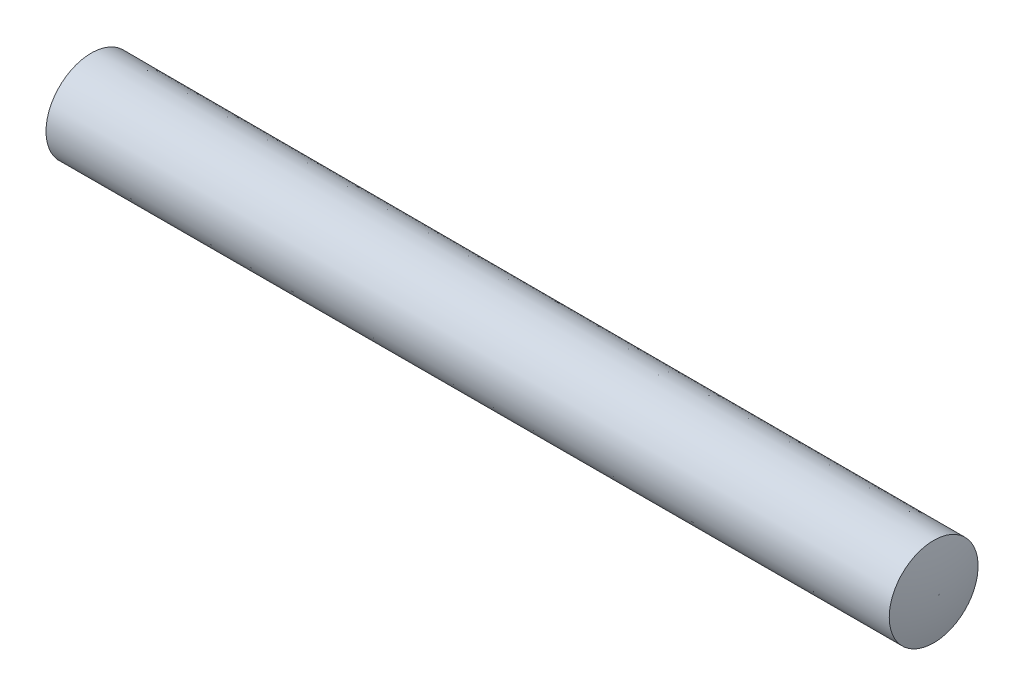
ISO-10303-21;
HEADER;
FILE_DESCRIPTION(('STEP AP214'),'2;1');
FILE_NAME('part.step','',(''),(''),'','','');
FILE_SCHEMA(('AUTOMOTIVE_DESIGN { 1 0 10303 214 1 1 1 1 }'));
ENDSEC;
DATA;
#1=APPLICATION_CONTEXT('core data for automotive mechanical design processes');
#2=APPLICATION_PROTOCOL_DEFINITION('international standard','automotive_design',2000,#1);
#3=PRODUCT_CONTEXT('',#1,'mechanical');
#4=PRODUCT('Part','Part','',(#3));
#5=PRODUCT_RELATED_PRODUCT_CATEGORY('part','',(#4));
#6=PRODUCT_DEFINITION_FORMATION('','',#4);
#7=PRODUCT_DEFINITION_CONTEXT('part definition',#1,'design');
#8=PRODUCT_DEFINITION('design','',#6,#7);
#9=PRODUCT_DEFINITION_SHAPE('','',#8);
#10=(LENGTH_UNIT() NAMED_UNIT(*) SI_UNIT(.MILLI.,.METRE.));
#11=(NAMED_UNIT(*) PLANE_ANGLE_UNIT() SI_UNIT($,.RADIAN.));
#12=(NAMED_UNIT(*) SI_UNIT($,.STERADIAN.) SOLID_ANGLE_UNIT());
#13=UNCERTAINTY_MEASURE_WITH_UNIT(LENGTH_MEASURE(1.E-05),#10,'distance_accuracy_value','');
#14=(GEOMETRIC_REPRESENTATION_CONTEXT(3) GLOBAL_UNCERTAINTY_ASSIGNED_CONTEXT((#13)) GLOBAL_UNIT_ASSIGNED_CONTEXT((#10,
#11,#12)) REPRESENTATION_CONTEXT('',''));
#15=CARTESIAN_POINT('',(0.,0.,0.));
#16=DIRECTION('',(0.,0.,1.));
#17=DIRECTION('',(1.,0.,0.));
#18=AXIS2_PLACEMENT_3D('',#15,#16,#17);
#19=CARTESIAN_POINT('',(22.5166284741041,0.,0.));
#20=DIRECTION('',(-1.,0.,0.));
#21=DIRECTION('',(0.,0.,1.));
#22=AXIS2_PLACEMENT_3D('',#19,#20,#21);
#23=PLANE('',#22);
#24=CARTESIAN_POINT('',(22.5166284741041,0.,0.));
#25=DIRECTION('',(-1.,0.,0.));
#26=DIRECTION('',(0.,0.,1.));
#27=AXIS2_PLACEMENT_3D('',#24,#25,#26);
#28=CIRCLE('',#27,0.011938);
#29=CARTESIAN_POINT('',(22.5166284741041,0.,0.011938));
#30=VERTEX_POINT('',#29);
#31=EDGE_CURVE('E10',#30,#30,#28,.T.);
#32=ORIENTED_EDGE('',*,*,#31,.F.);
#33=EDGE_LOOP('',(#32));
#34=FACE_BOUND('',#33,.T.);
#35=ADVANCED_FACE('F30',(#34),#23,.F.);
#36=CARTESIAN_POINT('',(17.7414284741041,0.,0.));
#37=DIRECTION('',(-1.,0.,0.));
#38=DIRECTION('',(0.,0.,1.));
#39=AXIS2_PLACEMENT_3D('',#36,#37,#38);
#40=DEGENERATE_TOROIDAL_SURFACE('',#39,0.011938,4.7752,.T.);
#41=CARTESIAN_POINT('',(22.3735665313799,0.,0.));
#42=DIRECTION('',(-1.,0.,0.));
#43=DIRECTION('',(0.,0.,1.));
#44=AXIS2_PLACEMENT_3D('',#41,#42,#43);
#45=CIRCLE('',#44,1.17203802083333);
#46=CARTESIAN_POINT('',(22.3735665313799,0.,1.17203802083333));
#47=VERTEX_POINT('',#46);
#48=EDGE_CURVE('E36',#47,#47,#45,.T.);
#49=ORIENTED_EDGE('',*,*,#48,.F.);
#50=EDGE_LOOP('',(#49));
#51=FACE_BOUND('',#50,.T.);
#52=ORIENTED_EDGE('',*,*,#31,.T.);
#53=EDGE_LOOP('',(#52));
#54=FACE_BOUND('',#53,.T.);
#55=ADVANCED_FACE('F60',(#51,#54),#40,.T.);
#56=CARTESIAN_POINT('',(22.3735665313799,0.,0.));
#57=DIRECTION('',(-1.,0.,0.));
#58=DIRECTION('',(0.,0.,1.));
#59=AXIS2_PLACEMENT_3D('',#56,#57,#58);
#60=CONICAL_SURFACE('',#59,1.17203802083333,0.000979166353735826);
#61=CARTESIAN_POINT('',(0.148566531379863,0.,0.));
#62=DIRECTION('',(-1.,0.,0.));
#63=DIRECTION('',(0.,0.,1.));
#64=AXIS2_PLACEMENT_3D('',#61,#62,#63);
#65=CIRCLE('',#64,1.1938);
#66=CARTESIAN_POINT('',(0.148566531379863,0.,1.1938));
#67=VERTEX_POINT('',#66);
#68=EDGE_CURVE('E40',#67,#67,#65,.T.);
#69=ORIENTED_EDGE('',*,*,#68,.F.);
#70=EDGE_LOOP('',(#69));
#71=FACE_BOUND('',#70,.T.);
#72=ORIENTED_EDGE('',*,*,#48,.T.);
#73=EDGE_LOOP('',(#72));
#74=FACE_BOUND('',#73,.T.);
#75=ADVANCED_FACE('F55',(#71,#74),#60,.T.);
#76=CARTESIAN_POINT('',(4.7752,0.,0.));
#77=DIRECTION('',(-1.,0.,0.));
#78=DIRECTION('',(0.,0.,1.));
#79=AXIS2_PLACEMENT_3D('',#76,#77,#78);
#80=DEGENERATE_TOROIDAL_SURFACE('',#79,0.011938,4.7752,.T.);
#81=CARTESIAN_POINT('',(0.,0.,0.));
#82=DIRECTION('',(-1.,0.,0.));
#83=DIRECTION('',(0.,0.,1.));
#84=AXIS2_PLACEMENT_3D('',#81,#82,#83);
#85=CIRCLE('',#84,0.011938);
#86=CARTESIAN_POINT('',(0.,0.,0.011938));
#87=VERTEX_POINT('',#86);
#88=EDGE_CURVE('E44',#87,#87,#85,.T.);
#89=ORIENTED_EDGE('',*,*,#88,.F.);
#90=EDGE_LOOP('',(#89));
#91=FACE_BOUND('',#90,.T.);
#92=ORIENTED_EDGE('',*,*,#68,.T.);
#93=EDGE_LOOP('',(#92));
#94=FACE_BOUND('',#93,.T.);
#95=ADVANCED_FACE('F52',(#91,#94),#80,.T.);
#96=CARTESIAN_POINT('',(0.,0.,0.));
#97=DIRECTION('',(1.,0.,0.));
#98=DIRECTION('',(0.,0.,-1.));
#99=AXIS2_PLACEMENT_3D('',#96,#97,#98);
#100=PLANE('',#99);
#101=ORIENTED_EDGE('',*,*,#88,.T.);
#102=EDGE_LOOP('',(#101));
#103=FACE_BOUND('',#102,.T.);
#104=ADVANCED_FACE('F50',(#103),#100,.F.);
#105=CLOSED_SHELL('',(#35,#55,#75,#95,#104));
#106=MANIFOLD_SOLID_BREP('B2',#105);
#107=ADVANCED_BREP_SHAPE_REPRESENTATION('',(#18,#106),#14);
#108=SHAPE_DEFINITION_REPRESENTATION(#9,#107);
ENDSEC;
END-ISO-10303-21;
